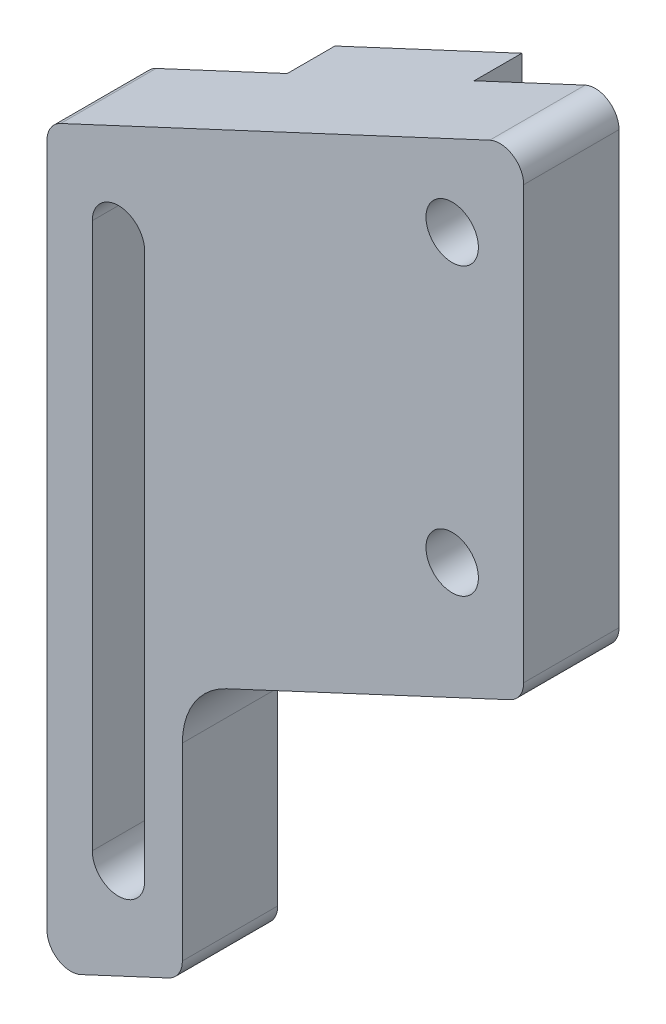
ISO-10303-21;
HEADER;
FILE_DESCRIPTION(('STEP AP214'),'2;1');
FILE_NAME('part.step','',(''),(''),'','','');
FILE_SCHEMA(('AUTOMOTIVE_DESIGN { 1 0 10303 214 1 1 1 1 }'));
ENDSEC;
DATA;
#1=APPLICATION_CONTEXT('core data for automotive mechanical design processes');
#2=APPLICATION_PROTOCOL_DEFINITION('international standard','automotive_design',2000,#1);
#3=PRODUCT_CONTEXT('',#1,'mechanical');
#4=PRODUCT('Part','Part','',(#3));
#5=PRODUCT_RELATED_PRODUCT_CATEGORY('part','',(#4));
#6=PRODUCT_DEFINITION_FORMATION('','',#4);
#7=PRODUCT_DEFINITION_CONTEXT('part definition',#1,'design');
#8=PRODUCT_DEFINITION('design','',#6,#7);
#9=PRODUCT_DEFINITION_SHAPE('','',#8);
#10=(LENGTH_UNIT() NAMED_UNIT(*) SI_UNIT(.MILLI.,.METRE.));
#11=(NAMED_UNIT(*) PLANE_ANGLE_UNIT() SI_UNIT($,.RADIAN.));
#12=(NAMED_UNIT(*) SI_UNIT($,.STERADIAN.) SOLID_ANGLE_UNIT());
#13=UNCERTAINTY_MEASURE_WITH_UNIT(LENGTH_MEASURE(1.E-05),#10,'distance_accuracy_value','');
#14=(GEOMETRIC_REPRESENTATION_CONTEXT(3) GLOBAL_UNCERTAINTY_ASSIGNED_CONTEXT((#13)) GLOBAL_UNIT_ASSIGNED_CONTEXT((#10,
#11,#12)) REPRESENTATION_CONTEXT('',''));
#15=CARTESIAN_POINT('',(0.,0.,0.));
#16=DIRECTION('',(0.,0.,1.));
#17=DIRECTION('',(1.,0.,0.));
#18=AXIS2_PLACEMENT_3D('',#15,#16,#17);
#19=CARTESIAN_POINT('',(0.,0.,15.));
#20=DIRECTION('',(0.,0.,-1.));
#21=DIRECTION('',(-1.,0.,0.));
#22=AXIS2_PLACEMENT_3D('',#19,#20,#21);
#23=PLANE('',#22);
#24=CARTESIAN_POINT('',(42.5,58.5545297989624,15.));
#25=DIRECTION('',(0.,0.,1.));
#26=DIRECTION('',(1.,0.,0.));
#27=AXIS2_PLACEMENT_3D('',#24,#25,#26);
#28=CIRCLE('',#27,2.74999999999999);
#29=CARTESIAN_POINT('',(45.25,58.5545297989624,15.));
#30=VERTEX_POINT('',#29);
#31=EDGE_CURVE('E694',#30,#30,#28,.T.);
#32=ORIENTED_EDGE('',*,*,#31,.F.);
#33=EDGE_LOOP('',(#32));
#34=FACE_BOUND('',#33,.T.);
#35=DIRECTION('',(0.906307787036648,0.422618261740704,0.));
#36=VECTOR('',#35,1.);
#37=CARTESIAN_POINT('',(50.,23.3153829077502,15.));
#38=LINE('',#37,#36);
#39=CARTESIAN_POINT('',(3.55654565435174,1.65844447520212,15.));
#40=VERTEX_POINT('',#39);
#41=CARTESIAN_POINT('',(12.7565456543517,5.94847493022816,15.));
#42=VERTEX_POINT('',#41);
#43=EDGE_CURVE('E291',#40,#42,#38,.T.);
#44=ORIENTED_EDGE('',*,*,#43,.T.);
#45=CARTESIAN_POINT('',(11.7,8.21424439781978,15.));
#46=DIRECTION('',(0.,0.,-1.));
#47=DIRECTION('',(-1.,0.,0.));
#48=AXIS2_PLACEMENT_3D('',#45,#46,#47);
#49=CIRCLE('',#48,2.5);
#50=CARTESIAN_POINT('',(14.2,8.21424439781978,15.));
#51=VERTEX_POINT('',#50);
#52=EDGE_CURVE('E338',#42,#51,#49,.F.);
#53=ORIENTED_EDGE('',*,*,#52,.T.);
#54=DIRECTION('',(0.,-1.,0.));
#55=VECTOR('',#54,1.);
#56=CARTESIAN_POINT('',(14.2,28.006076714441,15.));
#57=LINE('',#56,#55);
#58=CARTESIAN_POINT('',(14.2,28.006076714441,15.));
#59=VERTEX_POINT('',#58);
#60=EDGE_CURVE('E195',#59,#51,#57,.T.);
#61=ORIENTED_EDGE('',*,*,#60,.F.);
#62=CARTESIAN_POINT('',(22.2,28.006076714441,15.));
#63=DIRECTION('',(0.,0.,1.));
#64=DIRECTION('',(1.,0.,0.));
#65=AXIS2_PLACEMENT_3D('',#62,#63,#64);
#66=CIRCLE('',#65,8.);
#67=CARTESIAN_POINT('',(18.8190539060743,35.2565390107342,15.));
#68=VERTEX_POINT('',#67);
#69=EDGE_CURVE('E412',#68,#59,#66,.T.);
#70=ORIENTED_EDGE('',*,*,#69,.F.);
#71=DIRECTION('',(-0.906307787036647,-0.422618261740705,0.));
#72=VECTOR('',#71,1.);
#73=CARTESIAN_POINT('',(50.,49.7964529628502,15.));
#74=LINE('',#73,#72);
#75=CARTESIAN_POINT('',(48.5565456543517,49.1233591472772,15.));
#76=VERTEX_POINT('',#75);
#77=EDGE_CURVE('E418',#76,#68,#74,.T.);
#78=ORIENTED_EDGE('',*,*,#77,.F.);
#79=CARTESIAN_POINT('',(47.5,51.3891286148689,15.));
#80=DIRECTION('',(0.,0.,-1.));
#81=DIRECTION('',(-1.,0.,0.));
#82=AXIS2_PLACEMENT_3D('',#79,#80,#81);
#83=CIRCLE('',#82,2.5);
#84=CARTESIAN_POINT('',(50.,51.3891286148689,15.));
#85=VERTEX_POINT('',#84);
#86=EDGE_CURVE('E326',#76,#85,#83,.F.);
#87=ORIENTED_EDGE('',*,*,#86,.T.);
#88=DIRECTION('',(0.,1.,0.));
#89=VECTOR('',#88,1.);
#90=CARTESIAN_POINT('',(50.,100.551837235125,15.));
#91=LINE('',#90,#89);
#92=CARTESIAN_POINT('',(50.,96.6276232923312,15.));
#93=VERTEX_POINT('',#92);
#94=EDGE_CURVE('E295',#85,#93,#91,.T.);
#95=ORIENTED_EDGE('',*,*,#94,.T.);
#96=CARTESIAN_POINT('',(47.5,96.6276232923312,15.));
#97=DIRECTION('',(0.,0.,-1.));
#98=DIRECTION('',(-1.,0.,0.));
#99=AXIS2_PLACEMENT_3D('',#96,#97,#98);
#100=CIRCLE('',#99,2.5);
#101=CARTESIAN_POINT('',(46.4434543456482,98.8933927599228,15.));
#102=VERTEX_POINT('',#101);
#103=EDGE_CURVE('E335',#93,#102,#100,.F.);
#104=ORIENTED_EDGE('',*,*,#103,.T.);
#105=DIRECTION('',(-0.906307787036647,-0.422618261740704,0.));
#106=VECTOR('',#105,1.);
#107=CARTESIAN_POINT('',(0.,77.2364543273746,15.));
#108=LINE('',#107,#106);
#109=CARTESIAN_POINT('',(1.44345434564822,77.9095481429475,15.));
#110=VERTEX_POINT('',#109);
#111=EDGE_CURVE('E299',#102,#110,#108,.T.);
#112=ORIENTED_EDGE('',*,*,#111,.T.);
#113=CARTESIAN_POINT('',(2.49999999999998,75.6437786753559,15.));
#114=DIRECTION('',(0.,0.,-1.));
#115=DIRECTION('',(-1.,0.,0.));
#116=AXIS2_PLACEMENT_3D('',#113,#114,#115);
#117=CIRCLE('',#116,2.5);
#118=CARTESIAN_POINT('',(0.,75.6437786753559,15.));
#119=VERTEX_POINT('',#118);
#120=EDGE_CURVE('E329',#110,#119,#117,.F.);
#121=ORIENTED_EDGE('',*,*,#120,.T.);
#122=DIRECTION('',(0.,-1.,0.));
#123=VECTOR('',#122,1.);
#124=CARTESIAN_POINT('',(0.,0.,15.));
#125=LINE('',#124,#123);
#126=CARTESIAN_POINT('',(0.,3.92421394279375,15.));
#127=VERTEX_POINT('',#126);
#128=EDGE_CURVE('E303',#119,#127,#125,.T.);
#129=ORIENTED_EDGE('',*,*,#128,.T.);
#130=CARTESIAN_POINT('',(2.5,3.92421394279375,15.));
#131=DIRECTION('',(0.,0.,-1.));
#132=DIRECTION('',(-1.,0.,0.));
#133=AXIS2_PLACEMENT_3D('',#130,#131,#132);
#134=CIRCLE('',#133,2.5);
#135=EDGE_CURVE('E332',#127,#40,#134,.F.);
#136=ORIENTED_EDGE('',*,*,#135,.T.);
#137=EDGE_LOOP('',(#44,#53,#61,#70,#78,#87,#95,#104,#112,#121,#129,#136));
#138=FACE_BOUND('',#137,.T.);
#139=CARTESIAN_POINT('',(7.49999999999999,13.4973074361625,15.));
#140=DIRECTION('',(0.,0.,1.));
#141=DIRECTION('',(1.,0.,0.));
#142=AXIS2_PLACEMENT_3D('',#139,#140,#141);
#143=CIRCLE('',#142,2.75);
#144=CARTESIAN_POINT('',(4.74999999999999,13.4973074361625,15.));
#145=VERTEX_POINT('',#144);
#146=CARTESIAN_POINT('',(10.25,13.4973074361625,15.));
#147=VERTEX_POINT('',#146);
#148=EDGE_CURVE('E261',#145,#147,#143,.T.);
#149=ORIENTED_EDGE('',*,*,#148,.F.);
#150=DIRECTION('',(0.,-1.,0.));
#151=VECTOR('',#150,1.);
#152=CARTESIAN_POINT('',(4.74999999999999,13.4973074361625,15.));
#153=LINE('',#152,#151);
#154=CARTESIAN_POINT('',(4.74999999999998,70.7337617635372,15.));
#155=VERTEX_POINT('',#154);
#156=EDGE_CURVE('E271',#155,#145,#153,.T.);
#157=ORIENTED_EDGE('',*,*,#156,.F.);
#158=CARTESIAN_POINT('',(7.49999999999998,70.7337617635372,15.));
#159=DIRECTION('',(0.,0.,1.));
#160=DIRECTION('',(1.,0.,0.));
#161=AXIS2_PLACEMENT_3D('',#158,#159,#160);
#162=CIRCLE('',#161,2.75);
#163=CARTESIAN_POINT('',(10.25,70.7337617635372,15.));
#164=VERTEX_POINT('',#163);
#165=EDGE_CURVE('E267',#164,#155,#162,.T.);
#166=ORIENTED_EDGE('',*,*,#165,.F.);
#167=DIRECTION('',(0.,1.,0.));
#168=VECTOR('',#167,1.);
#169=CARTESIAN_POINT('',(10.25,13.4973074361625,15.));
#170=LINE('',#169,#168);
#171=EDGE_CURVE('E264',#147,#164,#170,.T.);
#172=ORIENTED_EDGE('',*,*,#171,.F.);
#173=EDGE_LOOP('',(#149,#157,#166,#172));
#174=FACE_BOUND('',#173,.T.);
#175=CARTESIAN_POINT('',(42.5,88.5545297989624,15.));
#176=DIRECTION('',(0.,0.,1.));
#177=DIRECTION('',(1.,0.,0.));
#178=AXIS2_PLACEMENT_3D('',#175,#176,#177);
#179=CIRCLE('',#178,2.74999999999999);
#180=CARTESIAN_POINT('',(45.25,88.5545297989624,15.));
#181=VERTEX_POINT('',#180);
#182=EDGE_CURVE('E685',#181,#181,#179,.T.);
#183=ORIENTED_EDGE('',*,*,#182,.F.);
#184=EDGE_LOOP('',(#183));
#185=FACE_BOUND('',#184,.T.);
#186=ADVANCED_FACE('F44',(#34,#138,#174,#185),#23,.F.);
#187=CARTESIAN_POINT('',(22.2,28.006076714441,0.));
#188=DIRECTION('',(0.,0.,1.));
#189=DIRECTION('',(1.,0.,0.));
#190=AXIS2_PLACEMENT_3D('',#187,#188,#189);
#191=CYLINDRICAL_SURFACE('',#190,8.);
#192=CARTESIAN_POINT('',(22.2,28.006076714441,5.));
#193=DIRECTION('',(0.,0.,-1.));
#194=DIRECTION('',(-1.,0.,0.));
#195=AXIS2_PLACEMENT_3D('',#192,#193,#194);
#196=CIRCLE('',#195,8.);
#197=CARTESIAN_POINT('',(14.2,28.006076714441,5.));
#198=VERTEX_POINT('',#197);
#199=CARTESIAN_POINT('',(18.8190539060743,35.2565390107342,5.));
#200=VERTEX_POINT('',#199);
#201=EDGE_CURVE('E224',#198,#200,#196,.T.);
#202=ORIENTED_EDGE('',*,*,#201,.T.);
#203=DIRECTION('',(0.,0.,1.));
#204=VECTOR('',#203,1.);
#205=CARTESIAN_POINT('',(18.8190539060743,35.2565390107342,0.));
#206=LINE('',#205,#204);
#207=EDGE_CURVE('E194',#200,#68,#206,.T.);
#208=ORIENTED_EDGE('',*,*,#207,.T.);
#209=ORIENTED_EDGE('',*,*,#69,.T.);
#210=DIRECTION('',(0.,0.,1.));
#211=VECTOR('',#210,1.);
#212=CARTESIAN_POINT('',(14.2,28.006076714441,0.));
#213=LINE('',#212,#211);
#214=EDGE_CURVE('E409',#198,#59,#213,.T.);
#215=ORIENTED_EDGE('',*,*,#214,.F.);
#216=EDGE_LOOP('',(#202,#208,#209,#215));
#217=FACE_BOUND('',#216,.T.);
#218=ADVANCED_FACE('F463',(#217),#191,.F.);
#219=CARTESIAN_POINT('',(0.,0.,0.));
#220=DIRECTION('',(0.,0.,-1.));
#221=DIRECTION('',(-1.,0.,0.));
#222=AXIS2_PLACEMENT_3D('',#219,#220,#221);
#223=PLANE('',#222);
#224=DIRECTION('',(-0.906307787036647,-0.422618261740705,0.));
#225=VECTOR('',#224,1.);
#226=CARTESIAN_POINT('',(50.,49.7964529628502,0.));
#227=LINE('',#226,#225);
#228=CARTESIAN_POINT('',(34.8,42.7085765588941,0.));
#229=VERTEX_POINT('',#228);
#230=CARTESIAN_POINT('',(15.2,33.568946459056,0.));
#231=VERTEX_POINT('',#230);
#232=EDGE_CURVE('E183',#229,#231,#227,.T.);
#233=ORIENTED_EDGE('',*,*,#232,.T.);
#234=DIRECTION('',(0.,1.,0.));
#235=VECTOR('',#234,1.);
#236=CARTESIAN_POINT('',(15.2,84.3243307313307,0.));
#237=LINE('',#236,#235);
#238=CARTESIAN_POINT('',(15.2,84.3243307313307,0.));
#239=VERTEX_POINT('',#238);
#240=EDGE_CURVE('E188',#231,#239,#237,.T.);
#241=ORIENTED_EDGE('',*,*,#240,.T.);
#242=DIRECTION('',(-0.906307787036647,-0.422618261740704,0.));
#243=VECTOR('',#242,1.);
#244=CARTESIAN_POINT('',(0.,77.2364543273746,0.));
#245=LINE('',#244,#243);
#246=CARTESIAN_POINT('',(34.8,93.4639608311688,0.));
#247=VERTEX_POINT('',#246);
#248=EDGE_CURVE('E290',#247,#239,#245,.T.);
#249=ORIENTED_EDGE('',*,*,#248,.F.);
#250=DIRECTION('',(0.,-1.,0.));
#251=VECTOR('',#250,1.);
#252=CARTESIAN_POINT('',(34.8,93.4639608311688,0.));
#253=LINE('',#252,#251);
#254=EDGE_CURVE('E190',#247,#229,#253,.T.);
#255=ORIENTED_EDGE('',*,*,#254,.T.);
#256=EDGE_LOOP('',(#233,#241,#249,#255));
#257=FACE_BOUND('',#256,.T.);
#258=ADVANCED_FACE('F185',(#257),#223,.T.);
#259=CARTESIAN_POINT('',(50.,23.3153829077502,15.));
#260=DIRECTION('',(-0.422618261740704,0.906307787036648,0.));
#261=DIRECTION('',(-0.906307787036648,-0.422618261740704,0.));
#262=AXIS2_PLACEMENT_3D('',#259,#260,#261);
#263=PLANE('',#262);
#264=DIRECTION('',(-0.906307787036648,-0.422618261740704,0.));
#265=VECTOR('',#264,1.);
#266=CARTESIAN_POINT('',(50.,23.3153829077502,5.));
#267=LINE('',#266,#265);
#268=CARTESIAN_POINT('',(12.7565456543517,5.94847493022816,5.));
#269=VERTEX_POINT('',#268);
#270=CARTESIAN_POINT('',(3.55654565435175,1.65844447520213,5.));
#271=VERTEX_POINT('',#270);
#272=EDGE_CURVE('E253',#269,#271,#267,.T.);
#273=ORIENTED_EDGE('',*,*,#272,.F.);
#274=DIRECTION('',(0.,0.,1.));
#275=VECTOR('',#274,1.);
#276=CARTESIAN_POINT('',(12.7565456543517,5.94847493022816,15.));
#277=LINE('',#276,#275);
#278=EDGE_CURVE('E322',#269,#42,#277,.T.);
#279=ORIENTED_EDGE('',*,*,#278,.T.);
#280=ORIENTED_EDGE('',*,*,#43,.F.);
#281=DIRECTION('',(0.,0.,-1.));
#282=VECTOR('',#281,1.);
#283=CARTESIAN_POINT('',(3.55654565435176,1.65844447520213,15.));
#284=LINE('',#283,#282);
#285=EDGE_CURVE('E318',#40,#271,#284,.T.);
#286=ORIENTED_EDGE('',*,*,#285,.T.);
#287=EDGE_LOOP('',(#273,#279,#280,#286));
#288=FACE_BOUND('',#287,.T.);
#289=ADVANCED_FACE('F392',(#288),#263,.F.);
#290=CARTESIAN_POINT('',(50.,100.551837235125,15.));
#291=DIRECTION('',(-1.,0.,0.));
#292=DIRECTION('',(0.,-1.,0.));
#293=AXIS2_PLACEMENT_3D('',#290,#291,#292);
#294=PLANE('',#293);
#295=DIRECTION('',(0.,-1.,0.));
#296=VECTOR('',#295,1.);
#297=CARTESIAN_POINT('',(50.,100.551837235125,5.));
#298=LINE('',#297,#296);
#299=CARTESIAN_POINT('',(50.,96.6276232923312,5.));
#300=VERTEX_POINT('',#299);
#301=CARTESIAN_POINT('',(50.,51.3891286148689,5.));
#302=VERTEX_POINT('',#301);
#303=EDGE_CURVE('E258',#300,#302,#298,.T.);
#304=ORIENTED_EDGE('',*,*,#303,.F.);
#305=DIRECTION('',(0.,0.,-1.));
#306=VECTOR('',#305,1.);
#307=CARTESIAN_POINT('',(50.,96.6276232923312,15.));
#308=LINE('',#307,#306);
#309=EDGE_CURVE('E367',#300,#93,#308,.F.);
#310=ORIENTED_EDGE('',*,*,#309,.T.);
#311=ORIENTED_EDGE('',*,*,#94,.F.);
#312=DIRECTION('',(0.,0.,1.));
#313=VECTOR('',#312,1.);
#314=CARTESIAN_POINT('',(50.,51.3891286148689,15.));
#315=LINE('',#314,#313);
#316=EDGE_CURVE('E61',#85,#302,#315,.F.);
#317=ORIENTED_EDGE('',*,*,#316,.T.);
#318=EDGE_LOOP('',(#304,#310,#311,#317));
#319=FACE_BOUND('',#318,.T.);
#320=ADVANCED_FACE('F448',(#319),#294,.F.);
#321=CARTESIAN_POINT('',(0.,77.2364543273746,15.));
#322=DIRECTION('',(0.422618261740705,-0.906307787036648,0.));
#323=DIRECTION('',(0.906307787036648,0.422618261740705,0.));
#324=AXIS2_PLACEMENT_3D('',#321,#322,#323);
#325=PLANE('',#324);
#326=ORIENTED_EDGE('',*,*,#111,.F.);
#327=DIRECTION('',(0.,0.,-1.));
#328=VECTOR('',#327,1.);
#329=CARTESIAN_POINT('',(46.4434543456482,98.8933927599228,15.));
#330=LINE('',#329,#328);
#331=CARTESIAN_POINT('',(46.4434543456482,98.8933927599228,5.));
#332=VERTEX_POINT('',#331);
#333=EDGE_CURVE('E356',#102,#332,#330,.T.);
#334=ORIENTED_EDGE('',*,*,#333,.T.);
#335=DIRECTION('',(0.906307787036648,0.422618261740705,0.));
#336=VECTOR('',#335,1.);
#337=CARTESIAN_POINT('',(0.,77.2364543273746,5.));
#338=LINE('',#337,#336);
#339=CARTESIAN_POINT('',(34.8,93.4639608311688,5.));
#340=VERTEX_POINT('',#339);
#341=EDGE_CURVE('E254',#340,#332,#338,.T.);
#342=ORIENTED_EDGE('',*,*,#341,.F.);
#343=DIRECTION('',(0.,0.,-1.));
#344=VECTOR('',#343,1.);
#345=CARTESIAN_POINT('',(34.8,93.4639608311688,5.));
#346=LINE('',#345,#344);
#347=EDGE_CURVE('E231',#340,#247,#346,.T.);
#348=ORIENTED_EDGE('',*,*,#347,.T.);
#349=ORIENTED_EDGE('',*,*,#248,.T.);
#350=DIRECTION('',(0.,0.,-1.));
#351=VECTOR('',#350,1.);
#352=CARTESIAN_POINT('',(15.2,84.3243307313307,5.));
#353=LINE('',#352,#351);
#354=CARTESIAN_POINT('',(15.2,84.3243307313307,5.));
#355=VERTEX_POINT('',#354);
#356=EDGE_CURVE('E211',#355,#239,#353,.T.);
#357=ORIENTED_EDGE('',*,*,#356,.F.);
#358=CARTESIAN_POINT('',(1.44345434564822,77.9095481429475,5.));
#359=VERTEX_POINT('',#358);
#360=EDGE_CURVE('E250',#359,#355,#338,.T.);
#361=ORIENTED_EDGE('',*,*,#360,.F.);
#362=DIRECTION('',(0.,0.,-1.));
#363=VECTOR('',#362,1.);
#364=CARTESIAN_POINT('',(1.44345434564822,77.9095481429475,15.));
#365=LINE('',#364,#363);
#366=EDGE_CURVE('E353',#359,#110,#365,.F.);
#367=ORIENTED_EDGE('',*,*,#366,.T.);
#368=EDGE_LOOP('',(#326,#334,#342,#348,#349,#357,#361,#367));
#369=FACE_BOUND('',#368,.T.);
#370=ADVANCED_FACE('F435',(#369),#325,.F.);
#371=CARTESIAN_POINT('',(0.,0.,15.));
#372=DIRECTION('',(1.,0.,0.));
#373=DIRECTION('',(0.,1.,0.));
#374=AXIS2_PLACEMENT_3D('',#371,#372,#373);
#375=PLANE('',#374);
#376=DIRECTION('',(0.,1.,0.));
#377=VECTOR('',#376,1.);
#378=CARTESIAN_POINT('',(0.,0.,5.));
#379=LINE('',#378,#377);
#380=CARTESIAN_POINT('',(0.,3.92421394279375,5.));
#381=VERTEX_POINT('',#380);
#382=CARTESIAN_POINT('',(0.,75.6437786753559,5.));
#383=VERTEX_POINT('',#382);
#384=EDGE_CURVE('E246',#381,#383,#379,.T.);
#385=ORIENTED_EDGE('',*,*,#384,.F.);
#386=DIRECTION('',(0.,0.,-1.));
#387=VECTOR('',#386,1.);
#388=CARTESIAN_POINT('',(0.,3.92421394279375,15.));
#389=LINE('',#388,#387);
#390=EDGE_CURVE('E54',#381,#127,#389,.F.);
#391=ORIENTED_EDGE('',*,*,#390,.T.);
#392=ORIENTED_EDGE('',*,*,#128,.F.);
#393=DIRECTION('',(0.,0.,-1.));
#394=VECTOR('',#393,1.);
#395=CARTESIAN_POINT('',(0.,75.6437786753559,15.));
#396=LINE('',#395,#394);
#397=EDGE_CURVE('E370',#119,#383,#396,.T.);
#398=ORIENTED_EDGE('',*,*,#397,.T.);
#399=EDGE_LOOP('',(#385,#391,#392,#398));
#400=FACE_BOUND('',#399,.T.);
#401=ADVANCED_FACE('F380',(#400),#375,.F.);
#402=CARTESIAN_POINT('',(7.49999999999999,13.4973074361625,15.));
#403=DIRECTION('',(0.,0.,-1.));
#404=DIRECTION('',(-1.,0.,0.));
#405=AXIS2_PLACEMENT_3D('',#402,#403,#404);
#406=CYLINDRICAL_SURFACE('',#405,2.75);
#407=DIRECTION('',(0.,0.,-1.));
#408=VECTOR('',#407,1.);
#409=CARTESIAN_POINT('',(10.25,13.4973074361625,15.));
#410=LINE('',#409,#408);
#411=CARTESIAN_POINT('',(10.25,13.4973074361625,5.));
#412=VERTEX_POINT('',#411);
#413=EDGE_CURVE('E286',#147,#412,#410,.T.);
#414=ORIENTED_EDGE('',*,*,#413,.T.);
#415=CARTESIAN_POINT('',(7.49999999999999,13.4973074361625,5.));
#416=DIRECTION('',(0.,0.,-1.));
#417=DIRECTION('',(-1.,0.,0.));
#418=AXIS2_PLACEMENT_3D('',#415,#416,#417);
#419=CIRCLE('',#418,2.75);
#420=CARTESIAN_POINT('',(4.74999999999999,13.4973074361625,5.));
#421=VERTEX_POINT('',#420);
#422=EDGE_CURVE('E242',#412,#421,#419,.T.);
#423=ORIENTED_EDGE('',*,*,#422,.T.);
#424=DIRECTION('',(0.,0.,-1.));
#425=VECTOR('',#424,1.);
#426=CARTESIAN_POINT('',(4.74999999999999,13.4973074361625,15.));
#427=LINE('',#426,#425);
#428=EDGE_CURVE('E274',#145,#421,#427,.T.);
#429=ORIENTED_EDGE('',*,*,#428,.F.);
#430=ORIENTED_EDGE('',*,*,#148,.T.);
#431=EDGE_LOOP('',(#414,#423,#429,#430));
#432=FACE_BOUND('',#431,.T.);
#433=ADVANCED_FACE('F474',(#432),#406,.F.);
#434=CARTESIAN_POINT('',(10.25,13.4973074361625,15.));
#435=DIRECTION('',(-1.,0.,0.));
#436=DIRECTION('',(0.,-1.,0.));
#437=AXIS2_PLACEMENT_3D('',#434,#435,#436);
#438=PLANE('',#437);
#439=DIRECTION('',(0.,0.,-1.));
#440=VECTOR('',#439,1.);
#441=CARTESIAN_POINT('',(10.25,70.7337617635372,15.));
#442=LINE('',#441,#440);
#443=CARTESIAN_POINT('',(10.25,70.7337617635372,5.));
#444=VERTEX_POINT('',#443);
#445=EDGE_CURVE('E282',#164,#444,#442,.T.);
#446=ORIENTED_EDGE('',*,*,#445,.T.);
#447=DIRECTION('',(0.,-1.,0.));
#448=VECTOR('',#447,1.);
#449=CARTESIAN_POINT('',(10.25,13.4973074361625,5.));
#450=LINE('',#449,#448);
#451=EDGE_CURVE('E238',#444,#412,#450,.T.);
#452=ORIENTED_EDGE('',*,*,#451,.T.);
#453=ORIENTED_EDGE('',*,*,#413,.F.);
#454=ORIENTED_EDGE('',*,*,#171,.T.);
#455=EDGE_LOOP('',(#446,#452,#453,#454));
#456=FACE_BOUND('',#455,.T.);
#457=ADVANCED_FACE('F631',(#456),#438,.T.);
#458=CARTESIAN_POINT('',(7.49999999999998,70.7337617635372,15.));
#459=DIRECTION('',(0.,0.,-1.));
#460=DIRECTION('',(-1.,0.,0.));
#461=AXIS2_PLACEMENT_3D('',#458,#459,#460);
#462=CYLINDRICAL_SURFACE('',#461,2.75);
#463=DIRECTION('',(0.,0.,-1.));
#464=VECTOR('',#463,1.);
#465=CARTESIAN_POINT('',(4.74999999999998,70.7337617635372,15.));
#466=LINE('',#465,#464);
#467=CARTESIAN_POINT('',(4.74999999999998,70.7337617635372,5.));
#468=VERTEX_POINT('',#467);
#469=EDGE_CURVE('E278',#155,#468,#466,.T.);
#470=ORIENTED_EDGE('',*,*,#469,.T.);
#471=CARTESIAN_POINT('',(7.49999999999998,70.7337617635372,5.));
#472=DIRECTION('',(0.,0.,-1.));
#473=DIRECTION('',(-1.,0.,0.));
#474=AXIS2_PLACEMENT_3D('',#471,#472,#473);
#475=CIRCLE('',#474,2.75);
#476=EDGE_CURVE('E230',#468,#444,#475,.T.);
#477=ORIENTED_EDGE('',*,*,#476,.T.);
#478=ORIENTED_EDGE('',*,*,#445,.F.);
#479=ORIENTED_EDGE('',*,*,#165,.T.);
#480=EDGE_LOOP('',(#470,#477,#478,#479));
#481=FACE_BOUND('',#480,.T.);
#482=ADVANCED_FACE('F638',(#481),#462,.F.);
#483=CARTESIAN_POINT('',(4.74999999999999,13.4973074361625,15.));
#484=DIRECTION('',(1.,0.,0.));
#485=DIRECTION('',(0.,1.,0.));
#486=AXIS2_PLACEMENT_3D('',#483,#484,#485);
#487=PLANE('',#486);
#488=ORIENTED_EDGE('',*,*,#428,.T.);
#489=DIRECTION('',(0.,1.,0.));
#490=VECTOR('',#489,1.);
#491=CARTESIAN_POINT('',(4.74999999999999,13.4973074361625,5.));
#492=LINE('',#491,#490);
#493=EDGE_CURVE('E306',#421,#468,#492,.T.);
#494=ORIENTED_EDGE('',*,*,#493,.T.);
#495=ORIENTED_EDGE('',*,*,#469,.F.);
#496=ORIENTED_EDGE('',*,*,#156,.T.);
#497=EDGE_LOOP('',(#488,#494,#495,#496));
#498=FACE_BOUND('',#497,.T.);
#499=ADVANCED_FACE('F569',(#498),#487,.T.);
#500=CARTESIAN_POINT('',(25.,50.2759186175624,5.));
#501=DIRECTION('',(0.,0.,-1.));
#502=DIRECTION('',(-1.,0.,0.));
#503=AXIS2_PLACEMENT_3D('',#500,#501,#502);
#504=PLANE('',#503);
#505=DIRECTION('',(0.,1.,0.));
#506=VECTOR('',#505,1.);
#507=CARTESIAN_POINT('',(14.2,50.2759186175624,5.));
#508=LINE('',#507,#506);
#509=CARTESIAN_POINT('',(14.2,8.21424439781979,5.));
#510=VERTEX_POINT('',#509);
#511=EDGE_CURVE('E315',#510,#198,#508,.T.);
#512=ORIENTED_EDGE('',*,*,#511,.F.);
#513=CARTESIAN_POINT('',(11.7,8.21424439781978,5.));
#514=DIRECTION('',(0.,0.,-1.));
#515=DIRECTION('',(-1.,0.,0.));
#516=AXIS2_PLACEMENT_3D('',#513,#514,#515);
#517=CIRCLE('',#516,2.5);
#518=EDGE_CURVE('E350',#510,#269,#517,.T.);
#519=ORIENTED_EDGE('',*,*,#518,.T.);
#520=ORIENTED_EDGE('',*,*,#272,.T.);
#521=CARTESIAN_POINT('',(2.5,3.92421394279375,5.));
#522=DIRECTION('',(0.,0.,-1.));
#523=DIRECTION('',(-1.,0.,0.));
#524=AXIS2_PLACEMENT_3D('',#521,#522,#523);
#525=CIRCLE('',#524,2.5);
#526=EDGE_CURVE('E347',#271,#381,#525,.T.);
#527=ORIENTED_EDGE('',*,*,#526,.T.);
#528=ORIENTED_EDGE('',*,*,#384,.T.);
#529=CARTESIAN_POINT('',(2.49999999999998,75.6437786753559,5.));
#530=DIRECTION('',(0.,0.,-1.));
#531=DIRECTION('',(-1.,0.,0.));
#532=AXIS2_PLACEMENT_3D('',#529,#530,#531);
#533=CIRCLE('',#532,2.5);
#534=EDGE_CURVE('E344',#383,#359,#533,.T.);
#535=ORIENTED_EDGE('',*,*,#534,.T.);
#536=ORIENTED_EDGE('',*,*,#360,.T.);
#537=DIRECTION('',(0.,1.,0.));
#538=VECTOR('',#537,1.);
#539=CARTESIAN_POINT('',(15.2,84.3243307313307,5.));
#540=LINE('',#539,#538);
#541=CARTESIAN_POINT('',(15.2,33.568946459056,5.));
#542=VERTEX_POINT('',#541);
#543=EDGE_CURVE('E221',#542,#355,#540,.T.);
#544=ORIENTED_EDGE('',*,*,#543,.F.);
#545=DIRECTION('',(-0.906307787036648,-0.422618261740705,0.));
#546=VECTOR('',#545,1.);
#547=CARTESIAN_POINT('',(18.8190539060743,35.2565390107342,5.));
#548=LINE('',#547,#546);
#549=EDGE_CURVE('E203',#200,#542,#548,.T.);
#550=ORIENTED_EDGE('',*,*,#549,.F.);
#551=ORIENTED_EDGE('',*,*,#201,.F.);
#552=EDGE_LOOP('',(#512,#519,#520,#527,#528,#535,#536,#544,#550,#551));
#553=FACE_BOUND('',#552,.T.);
#554=ORIENTED_EDGE('',*,*,#451,.F.);
#555=ORIENTED_EDGE('',*,*,#476,.F.);
#556=ORIENTED_EDGE('',*,*,#493,.F.);
#557=ORIENTED_EDGE('',*,*,#422,.F.);
#558=EDGE_LOOP('',(#554,#555,#556,#557));
#559=FACE_BOUND('',#558,.T.);
#560=ADVANCED_FACE('F396',(#553,#559),#504,.T.);
#561=CARTESIAN_POINT('',(15.2,84.3243307313307,5.));
#562=DIRECTION('',(-1.,0.,0.));
#563=DIRECTION('',(0.,-1.,0.));
#564=AXIS2_PLACEMENT_3D('',#561,#562,#563);
#565=PLANE('',#564);
#566=DIRECTION('',(0.,0.,-1.));
#567=VECTOR('',#566,1.);
#568=CARTESIAN_POINT('',(15.2,33.568946459056,9.95024395695247));
#569=LINE('',#568,#567);
#570=EDGE_CURVE('E198',#542,#231,#569,.T.);
#571=ORIENTED_EDGE('',*,*,#570,.F.);
#572=ORIENTED_EDGE('',*,*,#543,.T.);
#573=ORIENTED_EDGE('',*,*,#356,.T.);
#574=ORIENTED_EDGE('',*,*,#240,.F.);
#575=EDGE_LOOP('',(#571,#572,#573,#574));
#576=FACE_BOUND('',#575,.T.);
#577=ADVANCED_FACE('F209',(#576),#565,.T.);
#578=CARTESIAN_POINT('',(42.5,58.5545297989624,5.));
#579=DIRECTION('',(0.,0.,-1.));
#580=DIRECTION('',(-1.,0.,0.));
#581=AXIS2_PLACEMENT_3D('',#578,#579,#580);
#582=CIRCLE('',#581,2.74999999999999);
#583=CARTESIAN_POINT('',(39.75,58.5545297989624,5.));
#584=VERTEX_POINT('',#583);
#585=EDGE_CURVE('E681',#584,#584,#582,.T.);
#586=ORIENTED_EDGE('',*,*,#585,.F.);
#587=EDGE_LOOP('',(#586));
#588=FACE_BOUND('',#587,.T.);
#589=CARTESIAN_POINT('',(42.5,88.5545297989624,5.));
#590=DIRECTION('',(0.,0.,-1.));
#591=DIRECTION('',(-1.,0.,0.));
#592=AXIS2_PLACEMENT_3D('',#589,#590,#591);
#593=CIRCLE('',#592,2.74999999999999);
#594=CARTESIAN_POINT('',(39.75,88.5545297989624,5.));
#595=VERTEX_POINT('',#594);
#596=EDGE_CURVE('E48',#595,#595,#593,.T.);
#597=ORIENTED_EDGE('',*,*,#596,.F.);
#598=EDGE_LOOP('',(#597));
#599=FACE_BOUND('',#598,.T.);
#600=ORIENTED_EDGE('',*,*,#341,.T.);
#601=CARTESIAN_POINT('',(47.5,96.6276232923312,5.));
#602=DIRECTION('',(0.,0.,-1.));
#603=DIRECTION('',(-1.,0.,0.));
#604=AXIS2_PLACEMENT_3D('',#601,#602,#603);
#605=CIRCLE('',#604,2.5);
#606=EDGE_CURVE('E68',#332,#300,#605,.T.);
#607=ORIENTED_EDGE('',*,*,#606,.T.);
#608=ORIENTED_EDGE('',*,*,#303,.T.);
#609=CARTESIAN_POINT('',(47.5,51.3891286148689,5.));
#610=DIRECTION('',(0.,0.,-1.));
#611=DIRECTION('',(-1.,0.,0.));
#612=AXIS2_PLACEMENT_3D('',#609,#610,#611);
#613=CIRCLE('',#612,2.5);
#614=CARTESIAN_POINT('',(48.5565456543517,49.1233591472772,5.));
#615=VERTEX_POINT('',#614);
#616=EDGE_CURVE('E360',#302,#615,#613,.T.);
#617=ORIENTED_EDGE('',*,*,#616,.T.);
#618=DIRECTION('',(0.906307787036648,0.422618261740705,0.));
#619=VECTOR('',#618,1.);
#620=CARTESIAN_POINT('',(29.6488008791477,40.3065329601593,5.));
#621=LINE('',#620,#619);
#622=CARTESIAN_POINT('',(34.8,42.7085765588941,5.));
#623=VERTEX_POINT('',#622);
#624=EDGE_CURVE('E424',#623,#615,#621,.T.);
#625=ORIENTED_EDGE('',*,*,#624,.F.);
#626=DIRECTION('',(0.,-1.,0.));
#627=VECTOR('',#626,1.);
#628=CARTESIAN_POINT('',(34.8,93.4639608311688,5.));
#629=LINE('',#628,#627);
#630=EDGE_CURVE('E214',#340,#623,#629,.T.);
#631=ORIENTED_EDGE('',*,*,#630,.F.);
#632=EDGE_LOOP('',(#600,#607,#608,#617,#625,#631));
#633=FACE_BOUND('',#632,.T.);
#634=ADVANCED_FACE('F442',(#588,#599,#633),#504,.T.);
#635=CARTESIAN_POINT('',(34.8,93.4639608311688,5.));
#636=DIRECTION('',(1.,0.,0.));
#637=DIRECTION('',(0.,1.,0.));
#638=AXIS2_PLACEMENT_3D('',#635,#636,#637);
#639=PLANE('',#638);
#640=DIRECTION('',(0.,0.,1.));
#641=VECTOR('',#640,1.);
#642=CARTESIAN_POINT('',(34.8,42.7085765588941,5.));
#643=LINE('',#642,#641);
#644=EDGE_CURVE('E312',#229,#623,#643,.T.);
#645=ORIENTED_EDGE('',*,*,#644,.F.);
#646=ORIENTED_EDGE('',*,*,#254,.F.);
#647=ORIENTED_EDGE('',*,*,#347,.F.);
#648=ORIENTED_EDGE('',*,*,#630,.T.);
#649=EDGE_LOOP('',(#645,#646,#647,#648));
#650=FACE_BOUND('',#649,.T.);
#651=ADVANCED_FACE('F440',(#650),#639,.T.);
#652=CARTESIAN_POINT('',(14.2,28.006076714441,0.));
#653=DIRECTION('',(-1.,0.,0.));
#654=DIRECTION('',(0.,-1.,0.));
#655=AXIS2_PLACEMENT_3D('',#652,#653,#654);
#656=PLANE('',#655);
#657=ORIENTED_EDGE('',*,*,#60,.T.);
#658=DIRECTION('',(0.,0.,1.));
#659=VECTOR('',#658,1.);
#660=CARTESIAN_POINT('',(14.2,8.21424439781978,0.));
#661=LINE('',#660,#659);
#662=EDGE_CURVE('E341',#51,#510,#661,.F.);
#663=ORIENTED_EDGE('',*,*,#662,.T.);
#664=ORIENTED_EDGE('',*,*,#511,.T.);
#665=ORIENTED_EDGE('',*,*,#214,.T.);
#666=EDGE_LOOP('',(#657,#663,#664,#665));
#667=FACE_BOUND('',#666,.T.);
#668=ADVANCED_FACE('F407',(#667),#656,.F.);
#669=CARTESIAN_POINT('',(50.,49.7964529628502,0.));
#670=DIRECTION('',(-0.422618261740705,0.906307787036648,0.));
#671=DIRECTION('',(-0.906307787036648,-0.422618261740705,0.));
#672=AXIS2_PLACEMENT_3D('',#669,#670,#671);
#673=PLANE('',#672);
#674=ORIENTED_EDGE('',*,*,#624,.T.);
#675=DIRECTION('',(0.,0.,1.));
#676=VECTOR('',#675,1.);
#677=CARTESIAN_POINT('',(48.5565456543517,49.1233591472772,0.));
#678=LINE('',#677,#676);
#679=EDGE_CURVE('E12',#615,#76,#678,.T.);
#680=ORIENTED_EDGE('',*,*,#679,.T.);
#681=ORIENTED_EDGE('',*,*,#77,.T.);
#682=ORIENTED_EDGE('',*,*,#207,.F.);
#683=ORIENTED_EDGE('',*,*,#549,.T.);
#684=ORIENTED_EDGE('',*,*,#570,.T.);
#685=ORIENTED_EDGE('',*,*,#232,.F.);
#686=ORIENTED_EDGE('',*,*,#644,.T.);
#687=EDGE_LOOP('',(#674,#680,#681,#682,#683,#684,#685,#686));
#688=FACE_BOUND('',#687,.T.);
#689=ADVANCED_FACE('F200',(#688),#673,.F.);
#690=CARTESIAN_POINT('',(11.7,8.21424439781978,15.));
#691=DIRECTION('',(0.,0.,1.));
#692=DIRECTION('',(1.,0.,0.));
#693=AXIS2_PLACEMENT_3D('',#690,#691,#692);
#694=CYLINDRICAL_SURFACE('',#693,2.5);
#695=ORIENTED_EDGE('',*,*,#518,.F.);
#696=ORIENTED_EDGE('',*,*,#662,.F.);
#697=ORIENTED_EDGE('',*,*,#52,.F.);
#698=ORIENTED_EDGE('',*,*,#278,.F.);
#699=EDGE_LOOP('',(#695,#696,#697,#698));
#700=FACE_BOUND('',#699,.T.);
#701=ADVANCED_FACE('F402',(#700),#694,.T.);
#702=CARTESIAN_POINT('',(47.5,96.6276232923312,15.));
#703=DIRECTION('',(0.,0.,-1.));
#704=DIRECTION('',(-1.,0.,0.));
#705=AXIS2_PLACEMENT_3D('',#702,#703,#704);
#706=CYLINDRICAL_SURFACE('',#705,2.5);
#707=ORIENTED_EDGE('',*,*,#103,.F.);
#708=ORIENTED_EDGE('',*,*,#309,.F.);
#709=ORIENTED_EDGE('',*,*,#606,.F.);
#710=ORIENTED_EDGE('',*,*,#333,.F.);
#711=EDGE_LOOP('',(#707,#708,#709,#710));
#712=FACE_BOUND('',#711,.T.);
#713=ADVANCED_FACE('F451',(#712),#706,.T.);
#714=CARTESIAN_POINT('',(2.5,3.92421394279375,15.));
#715=DIRECTION('',(0.,0.,-1.));
#716=DIRECTION('',(-1.,0.,0.));
#717=AXIS2_PLACEMENT_3D('',#714,#715,#716);
#718=CYLINDRICAL_SURFACE('',#717,2.5);
#719=ORIENTED_EDGE('',*,*,#135,.F.);
#720=ORIENTED_EDGE('',*,*,#390,.F.);
#721=ORIENTED_EDGE('',*,*,#526,.F.);
#722=ORIENTED_EDGE('',*,*,#285,.F.);
#723=EDGE_LOOP('',(#719,#720,#721,#722));
#724=FACE_BOUND('',#723,.T.);
#725=ADVANCED_FACE('F389',(#724),#718,.T.);
#726=CARTESIAN_POINT('',(2.49999999999998,75.6437786753559,15.));
#727=DIRECTION('',(0.,0.,-1.));
#728=DIRECTION('',(-1.,0.,0.));
#729=AXIS2_PLACEMENT_3D('',#726,#727,#728);
#730=CYLINDRICAL_SURFACE('',#729,2.5);
#731=ORIENTED_EDGE('',*,*,#120,.F.);
#732=ORIENTED_EDGE('',*,*,#366,.F.);
#733=ORIENTED_EDGE('',*,*,#534,.F.);
#734=ORIENTED_EDGE('',*,*,#397,.F.);
#735=EDGE_LOOP('',(#731,#732,#733,#734));
#736=FACE_BOUND('',#735,.T.);
#737=ADVANCED_FACE('F454',(#736),#730,.T.);
#738=CARTESIAN_POINT('',(47.5,51.3891286148689,0.));
#739=DIRECTION('',(0.,0.,1.));
#740=DIRECTION('',(1.,0.,0.));
#741=AXIS2_PLACEMENT_3D('',#738,#739,#740);
#742=CYLINDRICAL_SURFACE('',#741,2.5);
#743=ORIENTED_EDGE('',*,*,#616,.F.);
#744=ORIENTED_EDGE('',*,*,#316,.F.);
#745=ORIENTED_EDGE('',*,*,#86,.F.);
#746=ORIENTED_EDGE('',*,*,#679,.F.);
#747=EDGE_LOOP('',(#743,#744,#745,#746));
#748=FACE_BOUND('',#747,.T.);
#749=ADVANCED_FACE('F46',(#748),#742,.T.);
#750=CARTESIAN_POINT('',(42.5,88.5545297989624,15.));
#751=DIRECTION('',(0.,0.,1.));
#752=DIRECTION('',(1.,0.,0.));
#753=AXIS2_PLACEMENT_3D('',#750,#751,#752);
#754=CYLINDRICAL_SURFACE('',#753,2.74999999999999);
#755=ORIENTED_EDGE('',*,*,#596,.T.);
#756=EDGE_LOOP('',(#755));
#757=FACE_BOUND('',#756,.T.);
#758=ORIENTED_EDGE('',*,*,#182,.T.);
#759=EDGE_LOOP('',(#758));
#760=FACE_BOUND('',#759,.T.);
#761=ADVANCED_FACE('F460',(#757,#760),#754,.F.);
#762=CARTESIAN_POINT('',(42.5,58.5545297989624,15.));
#763=DIRECTION('',(0.,0.,1.));
#764=DIRECTION('',(1.,0.,0.));
#765=AXIS2_PLACEMENT_3D('',#762,#763,#764);
#766=CYLINDRICAL_SURFACE('',#765,2.74999999999999);
#767=ORIENTED_EDGE('',*,*,#585,.T.);
#768=EDGE_LOOP('',(#767));
#769=FACE_BOUND('',#768,.T.);
#770=ORIENTED_EDGE('',*,*,#31,.T.);
#771=EDGE_LOOP('',(#770));
#772=FACE_BOUND('',#771,.T.);
#773=ADVANCED_FACE('F513',(#769,#772),#766,.F.);
#774=CLOSED_SHELL('',(#186,#218,#258,#289,#320,#370,#401,#433,#457,#482,#499,#560,#577,#634,
#651,#668,#689,#701,#713,#725,#737,#749,#761,#773));
#775=MANIFOLD_SOLID_BREP('B2',#774);
#776=ADVANCED_BREP_SHAPE_REPRESENTATION('',(#18,#775),#14);
#777=SHAPE_DEFINITION_REPRESENTATION(#9,#776);
ENDSEC;
END-ISO-10303-21;
